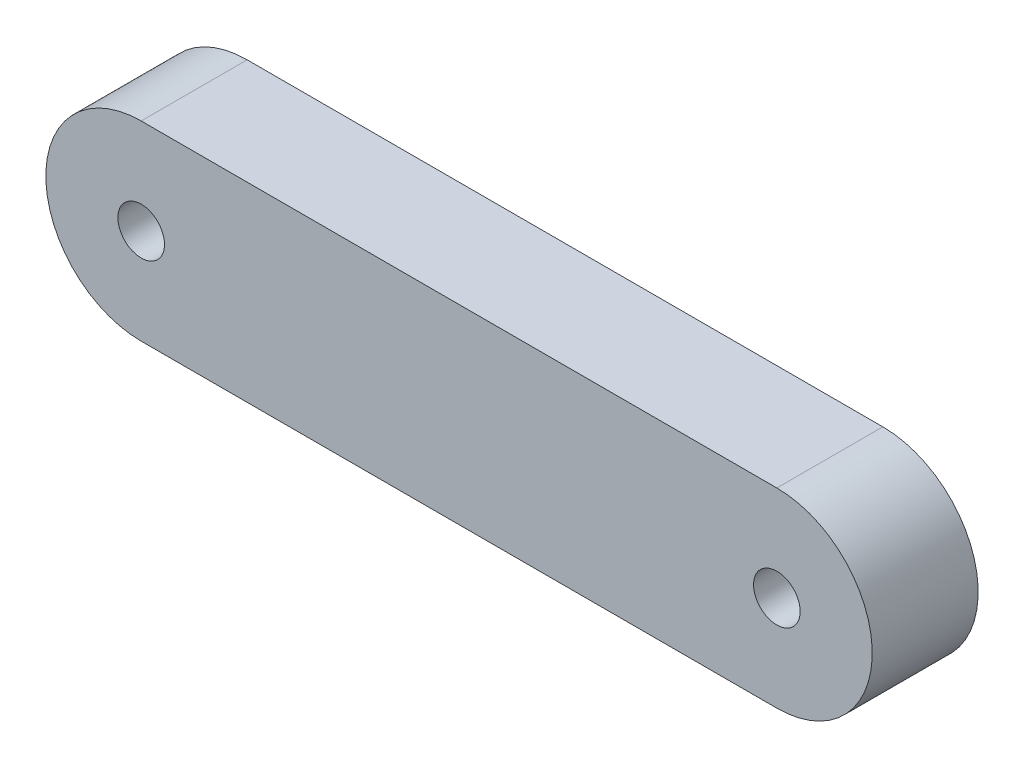
ISO-10303-21;
HEADER;
FILE_DESCRIPTION(('STEP AP214'),'2;1');
FILE_NAME('part.step','',(''),(''),'','','');
FILE_SCHEMA(('AUTOMOTIVE_DESIGN { 1 0 10303 214 1 1 1 1 }'));
ENDSEC;
DATA;
#1=APPLICATION_CONTEXT('core data for automotive mechanical design processes');
#2=APPLICATION_PROTOCOL_DEFINITION('international standard','automotive_design',2000,#1);
#3=PRODUCT_CONTEXT('',#1,'mechanical');
#4=PRODUCT('Part','Part','',(#3));
#5=PRODUCT_RELATED_PRODUCT_CATEGORY('part','',(#4));
#6=PRODUCT_DEFINITION_FORMATION('','',#4);
#7=PRODUCT_DEFINITION_CONTEXT('part definition',#1,'design');
#8=PRODUCT_DEFINITION('design','',#6,#7);
#9=PRODUCT_DEFINITION_SHAPE('','',#8);
#10=(LENGTH_UNIT() NAMED_UNIT(*) SI_UNIT(.MILLI.,.METRE.));
#11=(NAMED_UNIT(*) PLANE_ANGLE_UNIT() SI_UNIT($,.RADIAN.));
#12=(NAMED_UNIT(*) SI_UNIT($,.STERADIAN.) SOLID_ANGLE_UNIT());
#13=UNCERTAINTY_MEASURE_WITH_UNIT(LENGTH_MEASURE(1.E-05),#10,'distance_accuracy_value','');
#14=(GEOMETRIC_REPRESENTATION_CONTEXT(3) GLOBAL_UNCERTAINTY_ASSIGNED_CONTEXT((#13)) GLOBAL_UNIT_ASSIGNED_CONTEXT((#10,
#11,#12)) REPRESENTATION_CONTEXT('',''));
#15=CARTESIAN_POINT('',(0.,0.,0.));
#16=DIRECTION('',(0.,0.,1.));
#17=DIRECTION('',(1.,0.,0.));
#18=AXIS2_PLACEMENT_3D('',#15,#16,#17);
#19=CARTESIAN_POINT('',(15.,0.,5.));
#20=DIRECTION('',(0.,0.,-1.));
#21=DIRECTION('',(-1.,0.,0.));
#22=AXIS2_PLACEMENT_3D('',#19,#20,#21);
#23=CYLINDRICAL_SURFACE('',#22,4.5);
#24=CARTESIAN_POINT('',(15.,0.,0.));
#25=DIRECTION('',(0.,0.,1.));
#26=DIRECTION('',(1.,0.,0.));
#27=AXIS2_PLACEMENT_3D('',#24,#25,#26);
#28=CIRCLE('',#27,4.5);
#29=CARTESIAN_POINT('',(15.,-4.5,0.));
#30=VERTEX_POINT('',#29);
#31=CARTESIAN_POINT('',(15.,4.5,0.));
#32=VERTEX_POINT('',#31);
#33=EDGE_CURVE('E112',#30,#32,#28,.T.);
#34=ORIENTED_EDGE('',*,*,#33,.T.);
#35=DIRECTION('',(0.,0.,-1.));
#36=VECTOR('',#35,1.);
#37=CARTESIAN_POINT('',(15.,4.5,5.));
#38=LINE('',#37,#36);
#39=CARTESIAN_POINT('',(15.,4.5,5.));
#40=VERTEX_POINT('',#39);
#41=EDGE_CURVE('E11',#40,#32,#38,.T.);
#42=ORIENTED_EDGE('',*,*,#41,.F.);
#43=CARTESIAN_POINT('',(15.,0.,5.));
#44=DIRECTION('',(0.,0.,1.));
#45=DIRECTION('',(1.,0.,0.));
#46=AXIS2_PLACEMENT_3D('',#43,#44,#45);
#47=CIRCLE('',#46,4.5);
#48=CARTESIAN_POINT('',(15.,-4.5,5.));
#49=VERTEX_POINT('',#48);
#50=EDGE_CURVE('E96',#49,#40,#47,.T.);
#51=ORIENTED_EDGE('',*,*,#50,.F.);
#52=DIRECTION('',(0.,0.,-1.));
#53=VECTOR('',#52,1.);
#54=CARTESIAN_POINT('',(15.,-4.5,5.));
#55=LINE('',#54,#53);
#56=EDGE_CURVE('E108',#49,#30,#55,.T.);
#57=ORIENTED_EDGE('',*,*,#56,.T.);
#58=EDGE_LOOP('',(#34,#42,#51,#57));
#59=FACE_BOUND('',#58,.T.);
#60=ADVANCED_FACE('F44',(#59),#23,.T.);
#61=CARTESIAN_POINT('',(-15.,4.5,5.));
#62=DIRECTION('',(0.,-1.,0.));
#63=DIRECTION('',(0.,0.,-1.));
#64=AXIS2_PLACEMENT_3D('',#61,#62,#63);
#65=PLANE('',#64);
#66=DIRECTION('',(-1.,0.,0.));
#67=VECTOR('',#66,1.);
#68=CARTESIAN_POINT('',(-15.,4.5,0.));
#69=LINE('',#68,#67);
#70=CARTESIAN_POINT('',(-15.,4.5,0.));
#71=VERTEX_POINT('',#70);
#72=EDGE_CURVE('E101',#32,#71,#69,.T.);
#73=ORIENTED_EDGE('',*,*,#72,.T.);
#74=DIRECTION('',(0.,0.,-1.));
#75=VECTOR('',#74,1.);
#76=CARTESIAN_POINT('',(-15.,4.5,5.));
#77=LINE('',#76,#75);
#78=CARTESIAN_POINT('',(-15.,4.5,5.));
#79=VERTEX_POINT('',#78);
#80=EDGE_CURVE('E53',#79,#71,#77,.T.);
#81=ORIENTED_EDGE('',*,*,#80,.F.);
#82=DIRECTION('',(-1.,0.,0.));
#83=VECTOR('',#82,1.);
#84=CARTESIAN_POINT('',(-15.,4.5,5.));
#85=LINE('',#84,#83);
#86=EDGE_CURVE('E91',#40,#79,#85,.T.);
#87=ORIENTED_EDGE('',*,*,#86,.F.);
#88=ORIENTED_EDGE('',*,*,#41,.T.);
#89=EDGE_LOOP('',(#73,#81,#87,#88));
#90=FACE_BOUND('',#89,.T.);
#91=ADVANCED_FACE('F100',(#90),#65,.F.);
#92=CARTESIAN_POINT('',(-15.,0.,5.));
#93=DIRECTION('',(0.,0.,-1.));
#94=DIRECTION('',(-1.,0.,0.));
#95=AXIS2_PLACEMENT_3D('',#92,#93,#94);
#96=CYLINDRICAL_SURFACE('',#95,4.5);
#97=CARTESIAN_POINT('',(-15.,0.,0.));
#98=DIRECTION('',(0.,0.,1.));
#99=DIRECTION('',(1.,0.,0.));
#100=AXIS2_PLACEMENT_3D('',#97,#98,#99);
#101=CIRCLE('',#100,4.5);
#102=CARTESIAN_POINT('',(-15.,-4.5,0.));
#103=VERTEX_POINT('',#102);
#104=EDGE_CURVE('E78',#71,#103,#101,.T.);
#105=ORIENTED_EDGE('',*,*,#104,.T.);
#106=DIRECTION('',(0.,0.,-1.));
#107=VECTOR('',#106,1.);
#108=CARTESIAN_POINT('',(-15.,-4.5,5.));
#109=LINE('',#108,#107);
#110=CARTESIAN_POINT('',(-15.,-4.5,5.));
#111=VERTEX_POINT('',#110);
#112=EDGE_CURVE('E103',#111,#103,#109,.T.);
#113=ORIENTED_EDGE('',*,*,#112,.F.);
#114=CARTESIAN_POINT('',(-15.,0.,5.));
#115=DIRECTION('',(0.,0.,1.));
#116=DIRECTION('',(1.,0.,0.));
#117=AXIS2_PLACEMENT_3D('',#114,#115,#116);
#118=CIRCLE('',#117,4.5);
#119=EDGE_CURVE('E94',#79,#111,#118,.T.);
#120=ORIENTED_EDGE('',*,*,#119,.F.);
#121=ORIENTED_EDGE('',*,*,#80,.T.);
#122=EDGE_LOOP('',(#105,#113,#120,#121));
#123=FACE_BOUND('',#122,.T.);
#124=ADVANCED_FACE('F104',(#123),#96,.T.);
#125=CARTESIAN_POINT('',(-15.,-4.5,5.));
#126=DIRECTION('',(0.,1.,0.));
#127=DIRECTION('',(0.,0.,1.));
#128=AXIS2_PLACEMENT_3D('',#125,#126,#127);
#129=PLANE('',#128);
#130=DIRECTION('',(1.,0.,0.));
#131=VECTOR('',#130,1.);
#132=CARTESIAN_POINT('',(-15.,-4.5,0.));
#133=LINE('',#132,#131);
#134=EDGE_CURVE('E84',#103,#30,#133,.T.);
#135=ORIENTED_EDGE('',*,*,#134,.T.);
#136=ORIENTED_EDGE('',*,*,#56,.F.);
#137=DIRECTION('',(1.,0.,0.));
#138=VECTOR('',#137,1.);
#139=CARTESIAN_POINT('',(-15.,-4.5,5.));
#140=LINE('',#139,#138);
#141=EDGE_CURVE('E61',#111,#49,#140,.T.);
#142=ORIENTED_EDGE('',*,*,#141,.F.);
#143=ORIENTED_EDGE('',*,*,#112,.T.);
#144=EDGE_LOOP('',(#135,#136,#142,#143));
#145=FACE_BOUND('',#144,.T.);
#146=ADVANCED_FACE('F126',(#145),#129,.F.);
#147=CARTESIAN_POINT('',(15.,0.,5.));
#148=DIRECTION('',(0.,0.,1.));
#149=DIRECTION('',(1.,0.,0.));
#150=AXIS2_PLACEMENT_3D('',#147,#148,#149);
#151=PLANE('',#150);
#152=CARTESIAN_POINT('',(-15.,0.,5.));
#153=DIRECTION('',(0.,0.,1.));
#154=DIRECTION('',(1.,0.,0.));
#155=AXIS2_PLACEMENT_3D('',#152,#153,#154);
#156=CIRCLE('',#155,1.1);
#157=CARTESIAN_POINT('',(-13.9,0.,5.));
#158=VERTEX_POINT('',#157);
#159=EDGE_CURVE('E141',#158,#158,#156,.T.);
#160=ORIENTED_EDGE('',*,*,#159,.F.);
#161=EDGE_LOOP('',(#160));
#162=FACE_BOUND('',#161,.T.);
#163=CARTESIAN_POINT('',(15.,0.,5.));
#164=DIRECTION('',(0.,0.,1.));
#165=DIRECTION('',(1.,0.,0.));
#166=AXIS2_PLACEMENT_3D('',#163,#164,#165);
#167=CIRCLE('',#166,1.1);
#168=CARTESIAN_POINT('',(16.1,0.,5.));
#169=VERTEX_POINT('',#168);
#170=EDGE_CURVE('E137',#169,#169,#167,.T.);
#171=ORIENTED_EDGE('',*,*,#170,.F.);
#172=EDGE_LOOP('',(#171));
#173=FACE_BOUND('',#172,.T.);
#174=ORIENTED_EDGE('',*,*,#50,.T.);
#175=ORIENTED_EDGE('',*,*,#86,.T.);
#176=ORIENTED_EDGE('',*,*,#119,.T.);
#177=ORIENTED_EDGE('',*,*,#141,.T.);
#178=EDGE_LOOP('',(#174,#175,#176,#177));
#179=FACE_BOUND('',#178,.T.);
#180=ADVANCED_FACE('F92',(#162,#173,#179),#151,.T.);
#181=CARTESIAN_POINT('',(15.,0.,0.));
#182=DIRECTION('',(0.,0.,1.));
#183=DIRECTION('',(1.,0.,0.));
#184=AXIS2_PLACEMENT_3D('',#181,#182,#183);
#185=PLANE('',#184);
#186=CARTESIAN_POINT('',(-15.,0.,0.));
#187=DIRECTION('',(0.,0.,1.));
#188=DIRECTION('',(1.,0.,0.));
#189=AXIS2_PLACEMENT_3D('',#186,#187,#188);
#190=CIRCLE('',#189,1.1);
#191=CARTESIAN_POINT('',(-13.9,0.,0.));
#192=VERTEX_POINT('',#191);
#193=EDGE_CURVE('E116',#192,#192,#190,.T.);
#194=ORIENTED_EDGE('',*,*,#193,.T.);
#195=EDGE_LOOP('',(#194));
#196=FACE_BOUND('',#195,.T.);
#197=CARTESIAN_POINT('',(15.,0.,0.));
#198=DIRECTION('',(0.,0.,1.));
#199=DIRECTION('',(1.,0.,0.));
#200=AXIS2_PLACEMENT_3D('',#197,#198,#199);
#201=CIRCLE('',#200,1.1);
#202=CARTESIAN_POINT('',(16.1,0.,0.));
#203=VERTEX_POINT('',#202);
#204=EDGE_CURVE('E133',#203,#203,#201,.T.);
#205=ORIENTED_EDGE('',*,*,#204,.T.);
#206=EDGE_LOOP('',(#205));
#207=FACE_BOUND('',#206,.T.);
#208=ORIENTED_EDGE('',*,*,#33,.F.);
#209=ORIENTED_EDGE('',*,*,#134,.F.);
#210=ORIENTED_EDGE('',*,*,#104,.F.);
#211=ORIENTED_EDGE('',*,*,#72,.F.);
#212=EDGE_LOOP('',(#208,#209,#210,#211));
#213=FACE_BOUND('',#212,.T.);
#214=ADVANCED_FACE('F129',(#196,#207,#213),#185,.F.);
#215=CARTESIAN_POINT('',(15.,0.,0.));
#216=DIRECTION('',(0.,0.,1.));
#217=DIRECTION('',(1.,0.,0.));
#218=AXIS2_PLACEMENT_3D('',#215,#216,#217);
#219=CYLINDRICAL_SURFACE('',#218,1.1);
#220=ORIENTED_EDGE('',*,*,#204,.F.);
#221=EDGE_LOOP('',(#220));
#222=FACE_BOUND('',#221,.T.);
#223=ORIENTED_EDGE('',*,*,#170,.T.);
#224=EDGE_LOOP('',(#223));
#225=FACE_BOUND('',#224,.T.);
#226=ADVANCED_FACE('F154',(#222,#225),#219,.F.);
#227=CARTESIAN_POINT('',(-15.,0.,0.));
#228=DIRECTION('',(0.,0.,1.));
#229=DIRECTION('',(1.,0.,0.));
#230=AXIS2_PLACEMENT_3D('',#227,#228,#229);
#231=CYLINDRICAL_SURFACE('',#230,1.1);
#232=ORIENTED_EDGE('',*,*,#193,.F.);
#233=EDGE_LOOP('',(#232));
#234=FACE_BOUND('',#233,.T.);
#235=ORIENTED_EDGE('',*,*,#159,.T.);
#236=EDGE_LOOP('',(#235));
#237=FACE_BOUND('',#236,.T.);
#238=ADVANCED_FACE('F151',(#234,#237),#231,.F.);
#239=CLOSED_SHELL('',(#60,#91,#124,#146,#180,#214,#226,#238));
#240=MANIFOLD_SOLID_BREP('B2',#239);
#241=ADVANCED_BREP_SHAPE_REPRESENTATION('',(#18,#240),#14);
#242=SHAPE_DEFINITION_REPRESENTATION(#9,#241);
ENDSEC;
END-ISO-10303-21;
